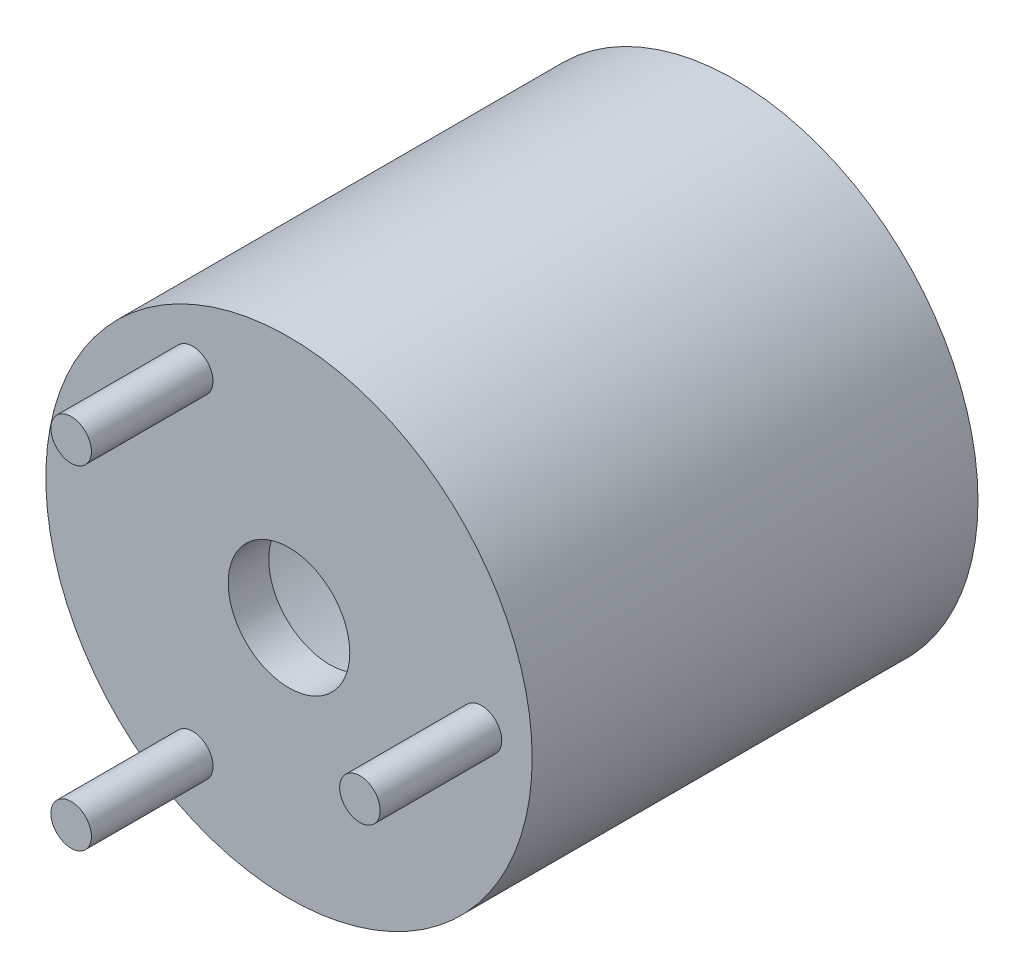
ISO-10303-21;
HEADER;
FILE_DESCRIPTION(('STEP AP214'),'2;1');
FILE_NAME('part.step','',(''),(''),'','','');
FILE_SCHEMA(('AUTOMOTIVE_DESIGN { 1 0 10303 214 1 1 1 1 }'));
ENDSEC;
DATA;
#1=APPLICATION_CONTEXT('core data for automotive mechanical design processes');
#2=APPLICATION_PROTOCOL_DEFINITION('international standard','automotive_design',2000,#1);
#3=PRODUCT_CONTEXT('',#1,'mechanical');
#4=PRODUCT('Part','Part','',(#3));
#5=PRODUCT_RELATED_PRODUCT_CATEGORY('part','',(#4));
#6=PRODUCT_DEFINITION_FORMATION('','',#4);
#7=PRODUCT_DEFINITION_CONTEXT('part definition',#1,'design');
#8=PRODUCT_DEFINITION('design','',#6,#7);
#9=PRODUCT_DEFINITION_SHAPE('','',#8);
#10=(LENGTH_UNIT() NAMED_UNIT(*) SI_UNIT(.MILLI.,.METRE.));
#11=(NAMED_UNIT(*) PLANE_ANGLE_UNIT() SI_UNIT($,.RADIAN.));
#12=(NAMED_UNIT(*) SI_UNIT($,.STERADIAN.) SOLID_ANGLE_UNIT());
#13=UNCERTAINTY_MEASURE_WITH_UNIT(LENGTH_MEASURE(1.E-05),#10,'distance_accuracy_value','');
#14=(GEOMETRIC_REPRESENTATION_CONTEXT(3) GLOBAL_UNCERTAINTY_ASSIGNED_CONTEXT((#13)) GLOBAL_UNIT_ASSIGNED_CONTEXT((#10,
#11,#12)) REPRESENTATION_CONTEXT('',''));
#15=CARTESIAN_POINT('',(0.,0.,0.));
#16=DIRECTION('',(0.,0.,1.));
#17=DIRECTION('',(1.,0.,0.));
#18=AXIS2_PLACEMENT_3D('',#15,#16,#17);
#19=CARTESIAN_POINT('',(-1.22460635382238E-13,0.,7.02943725152286));
#20=DIRECTION('',(0.,0.,1.));
#21=DIRECTION('',(1.,0.,0.));
#22=AXIS2_PLACEMENT_3D('',#19,#20,#21);
#23=CYLINDRICAL_SURFACE('',#22,5.5);
#24=CARTESIAN_POINT('',(-1.22460635382238E-13,0.,24.));
#25=DIRECTION('',(0.,0.,1.));
#26=DIRECTION('',(1.,0.,0.));
#27=AXIS2_PLACEMENT_3D('',#24,#25,#26);
#28=CIRCLE('',#27,5.5);
#29=CARTESIAN_POINT('',(5.49999999999988,0.,24.));
#30=VERTEX_POINT('',#29);
#31=EDGE_CURVE('E59',#30,#30,#28,.F.);
#32=ORIENTED_EDGE('',*,*,#31,.T.);
#33=EDGE_LOOP('',(#32));
#34=FACE_BOUND('',#33,.T.);
#35=CARTESIAN_POINT('',(-1.22460635382238E-13,0.,32.5));
#36=DIRECTION('',(0.,0.,1.));
#37=DIRECTION('',(1.,0.,0.));
#38=AXIS2_PLACEMENT_3D('',#35,#36,#37);
#39=CIRCLE('',#38,5.5);
#40=CARTESIAN_POINT('',(5.49999999999988,0.,32.5));
#41=VERTEX_POINT('',#40);
#42=EDGE_CURVE('E10',#41,#41,#39,.F.);
#43=ORIENTED_EDGE('',*,*,#42,.F.);
#44=EDGE_LOOP('',(#43));
#45=FACE_BOUND('',#44,.T.);
#46=ADVANCED_FACE('F41',(#34,#45),#23,.F.);
#47=CARTESIAN_POINT('',(-1.22460635382238E-13,0.,24.));
#48=DIRECTION('',(0.,0.,1.));
#49=DIRECTION('',(1.,0.,0.));
#50=AXIS2_PLACEMENT_3D('',#47,#48,#49);
#51=PLANE('',#50);
#52=CARTESIAN_POINT('',(-1.22460635382238E-13,0.,24.));
#53=DIRECTION('',(0.,0.,1.));
#54=DIRECTION('',(1.,0.,0.));
#55=AXIS2_PLACEMENT_3D('',#52,#53,#54);
#56=CIRCLE('',#55,4.5);
#57=CARTESIAN_POINT('',(4.49999999999988,0.,24.));
#58=VERTEX_POINT('',#57);
#59=EDGE_CURVE('E53',#58,#58,#56,.T.);
#60=ORIENTED_EDGE('',*,*,#59,.F.);
#61=EDGE_LOOP('',(#60));
#62=FACE_BOUND('',#61,.T.);
#63=ORIENTED_EDGE('',*,*,#31,.F.);
#64=EDGE_LOOP('',(#63));
#65=FACE_BOUND('',#64,.T.);
#66=ADVANCED_FACE('F105',(#62,#65),#51,.T.);
#67=CARTESIAN_POINT('',(-1.22460635382238E-13,0.,22.5));
#68=DIRECTION('',(0.,0.,1.));
#69=DIRECTION('',(1.,0.,0.));
#70=AXIS2_PLACEMENT_3D('',#67,#68,#69);
#71=PLANE('',#70);
#72=CARTESIAN_POINT('',(-1.22460635382238E-13,0.,22.5));
#73=DIRECTION('',(0.,0.,1.));
#74=DIRECTION('',(1.,0.,0.));
#75=AXIS2_PLACEMENT_3D('',#72,#73,#74);
#76=CIRCLE('',#75,6.);
#77=CARTESIAN_POINT('',(5.99999999999988,0.,22.5));
#78=VERTEX_POINT('',#77);
#79=EDGE_CURVE('E49',#78,#78,#76,.T.);
#80=ORIENTED_EDGE('',*,*,#79,.F.);
#81=EDGE_LOOP('',(#80));
#82=FACE_BOUND('',#81,.T.);
#83=CARTESIAN_POINT('',(-1.22460635382238E-13,0.,22.5));
#84=DIRECTION('',(0.,0.,1.));
#85=DIRECTION('',(1.,0.,0.));
#86=AXIS2_PLACEMENT_3D('',#83,#84,#85);
#87=CIRCLE('',#86,4.5);
#88=CARTESIAN_POINT('',(4.49999999999988,0.,22.5));
#89=VERTEX_POINT('',#88);
#90=EDGE_CURVE('E56',#89,#89,#87,.T.);
#91=ORIENTED_EDGE('',*,*,#90,.T.);
#92=EDGE_LOOP('',(#91));
#93=FACE_BOUND('',#92,.T.);
#94=ADVANCED_FACE('F112',(#82,#93),#71,.F.);
#95=CARTESIAN_POINT('',(-1.22460635382238E-13,0.,24.));
#96=DIRECTION('',(0.,0.,-1.));
#97=DIRECTION('',(-1.,0.,0.));
#98=AXIS2_PLACEMENT_3D('',#95,#96,#97);
#99=CYLINDRICAL_SURFACE('',#98,6.);
#100=CARTESIAN_POINT('',(-1.22460635382238E-13,0.,33.5));
#101=DIRECTION('',(0.,0.,1.));
#102=DIRECTION('',(1.,0.,0.));
#103=AXIS2_PLACEMENT_3D('',#100,#101,#102);
#104=CIRCLE('',#103,6.);
#105=CARTESIAN_POINT('',(5.99999999999988,0.,33.5));
#106=VERTEX_POINT('',#105);
#107=EDGE_CURVE('E64',#106,#106,#104,.T.);
#108=ORIENTED_EDGE('',*,*,#107,.F.);
#109=EDGE_LOOP('',(#108));
#110=FACE_BOUND('',#109,.T.);
#111=ORIENTED_EDGE('',*,*,#79,.T.);
#112=EDGE_LOOP('',(#111));
#113=FACE_BOUND('',#112,.T.);
#114=ADVANCED_FACE('F43',(#110,#113),#99,.T.);
#115=CARTESIAN_POINT('',(-1.22460635382238E-13,0.,24.));
#116=DIRECTION('',(0.,0.,-1.));
#117=DIRECTION('',(-1.,0.,0.));
#118=AXIS2_PLACEMENT_3D('',#115,#116,#117);
#119=CYLINDRICAL_SURFACE('',#118,4.5);
#120=ORIENTED_EDGE('',*,*,#59,.T.);
#121=EDGE_LOOP('',(#120));
#122=FACE_BOUND('',#121,.T.);
#123=ORIENTED_EDGE('',*,*,#90,.F.);
#124=EDGE_LOOP('',(#123));
#125=FACE_BOUND('',#124,.T.);
#126=ADVANCED_FACE('F122',(#122,#125),#119,.F.);
#127=CARTESIAN_POINT('',(-1.22460635382238E-13,0.,33.5));
#128=DIRECTION('',(0.,0.,1.));
#129=DIRECTION('',(1.,0.,0.));
#130=AXIS2_PLACEMENT_3D('',#127,#128,#129);
#131=PLANE('',#130);
#132=CARTESIAN_POINT('',(0.,0.,33.5));
#133=DIRECTION('',(0.,0.,1.));
#134=DIRECTION('',(1.,0.,0.));
#135=AXIS2_PLACEMENT_3D('',#132,#133,#134);
#136=CIRCLE('',#135,1.5);
#137=CARTESIAN_POINT('',(1.5,0.,33.5));
#138=VERTEX_POINT('',#137);
#139=EDGE_CURVE('E83',#138,#138,#136,.T.);
#140=ORIENTED_EDGE('',*,*,#139,.F.);
#141=EDGE_LOOP('',(#140));
#142=FACE_BOUND('',#141,.T.);
#143=ORIENTED_EDGE('',*,*,#107,.T.);
#144=EDGE_LOOP('',(#143));
#145=FACE_BOUND('',#144,.T.);
#146=CARTESIAN_POINT('',(4.74999999999988,0.,33.5));
#147=DIRECTION('',(0.,0.,1.));
#148=DIRECTION('',(1.,0.,0.));
#149=AXIS2_PLACEMENT_3D('',#146,#147,#148);
#150=CIRCLE('',#149,0.5);
#151=CARTESIAN_POINT('',(5.24999999999988,0.,33.5));
#152=VERTEX_POINT('',#151);
#153=EDGE_CURVE('E68',#152,#152,#150,.T.);
#154=ORIENTED_EDGE('',*,*,#153,.F.);
#155=EDGE_LOOP('',(#154));
#156=FACE_BOUND('',#155,.T.);
#157=CARTESIAN_POINT('',(-2.37499999999996,-4.11362066797597,33.5));
#158=DIRECTION('',(0.,0.,1.));
#159=DIRECTION('',(1.,0.,0.));
#160=AXIS2_PLACEMENT_3D('',#157,#158,#159);
#161=CIRCLE('',#160,0.5);
#162=CARTESIAN_POINT('',(-1.87499999999996,-4.11362066797597,33.5));
#163=VERTEX_POINT('',#162);
#164=EDGE_CURVE('E71',#163,#163,#161,.T.);
#165=ORIENTED_EDGE('',*,*,#164,.F.);
#166=EDGE_LOOP('',(#165));
#167=FACE_BOUND('',#166,.T.);
#168=CARTESIAN_POINT('',(-2.3749999999999,4.113620667976,33.5));
#169=DIRECTION('',(0.,0.,1.));
#170=DIRECTION('',(1.,0.,0.));
#171=AXIS2_PLACEMENT_3D('',#168,#169,#170);
#172=CIRCLE('',#171,0.5);
#173=CARTESIAN_POINT('',(-1.8749999999999,4.113620667976,33.5));
#174=VERTEX_POINT('',#173);
#175=EDGE_CURVE('E77',#174,#174,#172,.T.);
#176=ORIENTED_EDGE('',*,*,#175,.F.);
#177=EDGE_LOOP('',(#176));
#178=FACE_BOUND('',#177,.T.);
#179=ADVANCED_FACE('F118',(#142,#145,#156,#167,#178),#131,.T.);
#180=CARTESIAN_POINT('',(-2.3749999999999,4.113620667976,36.5));
#181=DIRECTION('',(0.,0.,1.));
#182=DIRECTION('',(1.,0.,0.));
#183=AXIS2_PLACEMENT_3D('',#180,#181,#182);
#184=PLANE('',#183);
#185=CARTESIAN_POINT('',(-2.3749999999999,4.113620667976,36.5));
#186=DIRECTION('',(0.,0.,1.));
#187=DIRECTION('',(1.,0.,0.));
#188=AXIS2_PLACEMENT_3D('',#185,#186,#187);
#189=CIRCLE('',#188,0.5);
#190=CARTESIAN_POINT('',(-1.8749999999999,4.113620667976,36.5));
#191=VERTEX_POINT('',#190);
#192=EDGE_CURVE('E80',#191,#191,#189,.T.);
#193=ORIENTED_EDGE('',*,*,#192,.T.);
#194=EDGE_LOOP('',(#193));
#195=FACE_BOUND('',#194,.T.);
#196=ADVANCED_FACE('F121',(#195),#184,.T.);
#197=CARTESIAN_POINT('',(-2.3749999999999,4.113620667976,36.5));
#198=DIRECTION('',(0.,0.,-1.));
#199=DIRECTION('',(-1.,0.,0.));
#200=AXIS2_PLACEMENT_3D('',#197,#198,#199);
#201=CYLINDRICAL_SURFACE('',#200,0.5);
#202=ORIENTED_EDGE('',*,*,#192,.F.);
#203=EDGE_LOOP('',(#202));
#204=FACE_BOUND('',#203,.T.);
#205=ORIENTED_EDGE('',*,*,#175,.T.);
#206=EDGE_LOOP('',(#205));
#207=FACE_BOUND('',#206,.T.);
#208=ADVANCED_FACE('F150',(#204,#207),#201,.T.);
#209=CARTESIAN_POINT('',(0.,0.,36.5));
#210=DIRECTION('',(0.,0.,1.));
#211=DIRECTION('',(1.,0.,0.));
#212=AXIS2_PLACEMENT_3D('',#209,#210,#211);
#213=PLANE('',#212);
#214=CARTESIAN_POINT('',(-2.37499999999996,-4.11362066797597,36.5));
#215=DIRECTION('',(0.,0.,1.));
#216=DIRECTION('',(1.,0.,0.));
#217=AXIS2_PLACEMENT_3D('',#214,#215,#216);
#218=CIRCLE('',#217,0.5);
#219=CARTESIAN_POINT('',(-1.87499999999996,-4.11362066797597,36.5));
#220=VERTEX_POINT('',#219);
#221=EDGE_CURVE('E74',#220,#220,#218,.T.);
#222=ORIENTED_EDGE('',*,*,#221,.T.);
#223=EDGE_LOOP('',(#222));
#224=FACE_BOUND('',#223,.T.);
#225=ADVANCED_FACE('F152',(#224),#213,.T.);
#226=CARTESIAN_POINT('',(-2.37499999999996,-4.11362066797597,36.5));
#227=DIRECTION('',(0.,0.,-1.));
#228=DIRECTION('',(-1.,0.,0.));
#229=AXIS2_PLACEMENT_3D('',#226,#227,#228);
#230=CYLINDRICAL_SURFACE('',#229,0.5);
#231=ORIENTED_EDGE('',*,*,#221,.F.);
#232=EDGE_LOOP('',(#231));
#233=FACE_BOUND('',#232,.T.);
#234=ORIENTED_EDGE('',*,*,#164,.T.);
#235=EDGE_LOOP('',(#234));
#236=FACE_BOUND('',#235,.T.);
#237=ADVANCED_FACE('F159',(#233,#236),#230,.T.);
#238=CARTESIAN_POINT('',(0.,0.,36.5));
#239=DIRECTION('',(0.,0.,1.));
#240=DIRECTION('',(1.,0.,0.));
#241=AXIS2_PLACEMENT_3D('',#238,#239,#240);
#242=PLANE('',#241);
#243=CARTESIAN_POINT('',(4.74999999999988,0.,36.5));
#244=DIRECTION('',(0.,0.,1.));
#245=DIRECTION('',(1.,0.,0.));
#246=AXIS2_PLACEMENT_3D('',#243,#244,#245);
#247=CIRCLE('',#246,0.5);
#248=CARTESIAN_POINT('',(5.24999999999988,0.,36.5));
#249=VERTEX_POINT('',#248);
#250=EDGE_CURVE('E67',#249,#249,#247,.T.);
#251=ORIENTED_EDGE('',*,*,#250,.T.);
#252=EDGE_LOOP('',(#251));
#253=FACE_BOUND('',#252,.T.);
#254=ADVANCED_FACE('F167',(#253),#242,.T.);
#255=CARTESIAN_POINT('',(4.74999999999988,0.,36.5));
#256=DIRECTION('',(0.,0.,-1.));
#257=DIRECTION('',(-1.,0.,0.));
#258=AXIS2_PLACEMENT_3D('',#255,#256,#257);
#259=CYLINDRICAL_SURFACE('',#258,0.5);
#260=ORIENTED_EDGE('',*,*,#250,.F.);
#261=EDGE_LOOP('',(#260));
#262=FACE_BOUND('',#261,.T.);
#263=ORIENTED_EDGE('',*,*,#153,.T.);
#264=EDGE_LOOP('',(#263));
#265=FACE_BOUND('',#264,.T.);
#266=ADVANCED_FACE('F101',(#262,#265),#259,.T.);
#267=CARTESIAN_POINT('',(0.,0.,32.5));
#268=DIRECTION('',(0.,0.,1.));
#269=DIRECTION('',(1.,0.,0.));
#270=AXIS2_PLACEMENT_3D('',#267,#268,#269);
#271=PLANE('',#270);
#272=CARTESIAN_POINT('',(0.,0.,32.5));
#273=DIRECTION('',(0.,0.,1.));
#274=DIRECTION('',(1.,0.,0.));
#275=AXIS2_PLACEMENT_3D('',#272,#273,#274);
#276=CIRCLE('',#275,1.5);
#277=CARTESIAN_POINT('',(1.5,0.,32.5));
#278=VERTEX_POINT('',#277);
#279=EDGE_CURVE('E45',#278,#278,#276,.T.);
#280=ORIENTED_EDGE('',*,*,#279,.T.);
#281=EDGE_LOOP('',(#280));
#282=FACE_BOUND('',#281,.T.);
#283=ORIENTED_EDGE('',*,*,#42,.T.);
#284=EDGE_LOOP('',(#283));
#285=FACE_BOUND('',#284,.T.);
#286=ADVANCED_FACE('F92',(#282,#285),#271,.F.);
#287=CARTESIAN_POINT('',(0.,0.,-135.25));
#288=DIRECTION('',(0.,0.,1.));
#289=DIRECTION('',(1.,0.,0.));
#290=AXIS2_PLACEMENT_3D('',#287,#288,#289);
#291=CYLINDRICAL_SURFACE('',#290,1.5);
#292=ORIENTED_EDGE('',*,*,#139,.T.);
#293=EDGE_LOOP('',(#292));
#294=FACE_BOUND('',#293,.T.);
#295=ORIENTED_EDGE('',*,*,#279,.F.);
#296=EDGE_LOOP('',(#295));
#297=FACE_BOUND('',#296,.T.);
#298=ADVANCED_FACE('F94',(#294,#297),#291,.F.);
#299=CLOSED_SHELL('',(#46,#66,#94,#114,#126,#179,#196,#208,#225,#237,#254,#266,#286,#298));
#300=MANIFOLD_SOLID_BREP('B2',#299);
#301=ADVANCED_BREP_SHAPE_REPRESENTATION('',(#18,#300),#14);
#302=SHAPE_DEFINITION_REPRESENTATION(#9,#301);
ENDSEC;
END-ISO-10303-21;
